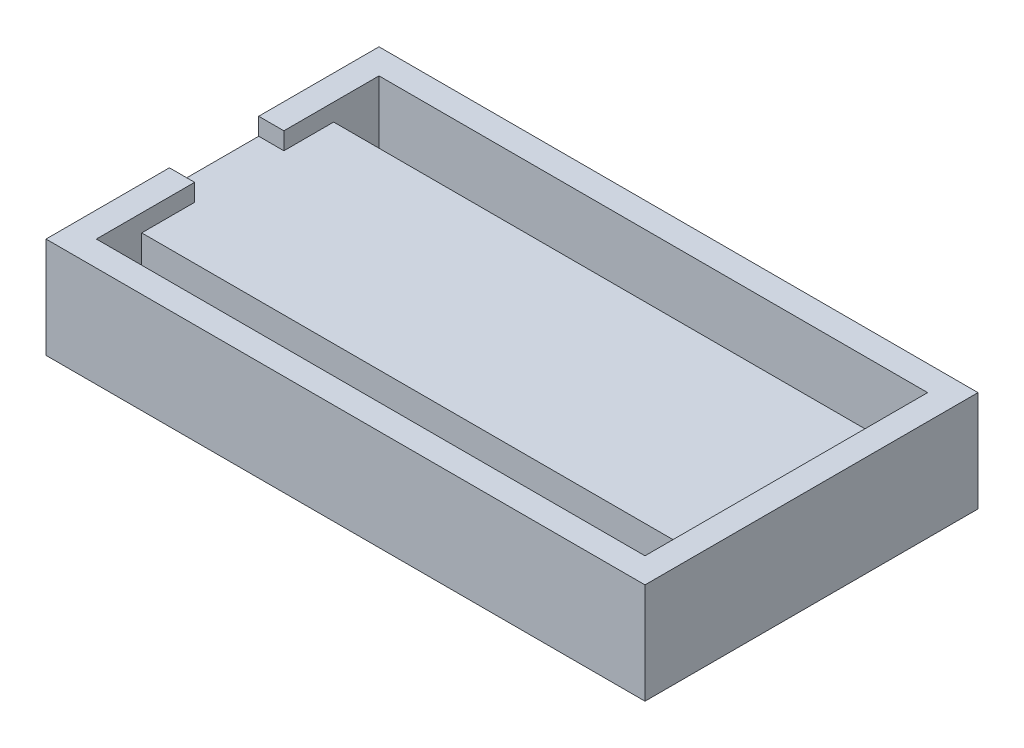
ISO-10303-21;
HEADER;
FILE_DESCRIPTION(('STEP AP214'),'2;1');
FILE_NAME('part.step','',(''),(''),'','','');
FILE_SCHEMA(('AUTOMOTIVE_DESIGN { 1 0 10303 214 1 1 1 1 }'));
ENDSEC;
DATA;
#1=APPLICATION_CONTEXT('core data for automotive mechanical design processes');
#2=APPLICATION_PROTOCOL_DEFINITION('international standard','automotive_design',2000,#1);
#3=PRODUCT_CONTEXT('',#1,'mechanical');
#4=PRODUCT('Part','Part','',(#3));
#5=PRODUCT_RELATED_PRODUCT_CATEGORY('part','',(#4));
#6=PRODUCT_DEFINITION_FORMATION('','',#4);
#7=PRODUCT_DEFINITION_CONTEXT('part definition',#1,'design');
#8=PRODUCT_DEFINITION('design','',#6,#7);
#9=PRODUCT_DEFINITION_SHAPE('','',#8);
#10=(LENGTH_UNIT() NAMED_UNIT(*) SI_UNIT(.MILLI.,.METRE.));
#11=(NAMED_UNIT(*) PLANE_ANGLE_UNIT() SI_UNIT($,.RADIAN.));
#12=(NAMED_UNIT(*) SI_UNIT($,.STERADIAN.) SOLID_ANGLE_UNIT());
#13=UNCERTAINTY_MEASURE_WITH_UNIT(LENGTH_MEASURE(1.E-05),#10,'distance_accuracy_value','');
#14=(GEOMETRIC_REPRESENTATION_CONTEXT(3) GLOBAL_UNCERTAINTY_ASSIGNED_CONTEXT((#13)) GLOBAL_UNIT_ASSIGNED_CONTEXT((#10,
#11,#12)) REPRESENTATION_CONTEXT('',''));
#15=CARTESIAN_POINT('',(0.,0.,0.));
#16=DIRECTION('',(0.,0.,1.));
#17=DIRECTION('',(1.,0.,0.));
#18=AXIS2_PLACEMENT_3D('',#15,#16,#17);
#19=CARTESIAN_POINT('',(29.725,10.,-16.525));
#20=DIRECTION('',(-1.,0.,0.));
#21=DIRECTION('',(0.,0.,1.));
#22=AXIS2_PLACEMENT_3D('',#19,#20,#21);
#23=PLANE('',#22);
#24=DIRECTION('',(0.,0.,-1.));
#25=VECTOR('',#24,1.);
#26=CARTESIAN_POINT('',(29.725,0.,-16.525));
#27=LINE('',#26,#25);
#28=CARTESIAN_POINT('',(29.725,0.,16.525));
#29=VERTEX_POINT('',#28);
#30=CARTESIAN_POINT('',(29.725,0.,-16.525));
#31=VERTEX_POINT('',#30);
#32=EDGE_CURVE('E198',#29,#31,#27,.T.);
#33=ORIENTED_EDGE('',*,*,#32,.T.);
#34=DIRECTION('',(0.,-1.,0.));
#35=VECTOR('',#34,1.);
#36=CARTESIAN_POINT('',(29.725,10.,-16.525));
#37=LINE('',#36,#35);
#38=CARTESIAN_POINT('',(29.725,10.,-16.525));
#39=VERTEX_POINT('',#38);
#40=EDGE_CURVE('E237',#39,#31,#37,.T.);
#41=ORIENTED_EDGE('',*,*,#40,.F.);
#42=DIRECTION('',(0.,0.,-1.));
#43=VECTOR('',#42,1.);
#44=CARTESIAN_POINT('',(29.725,10.,-16.525));
#45=LINE('',#44,#43);
#46=CARTESIAN_POINT('',(29.725,10.,16.525));
#47=VERTEX_POINT('',#46);
#48=EDGE_CURVE('E218',#47,#39,#45,.T.);
#49=ORIENTED_EDGE('',*,*,#48,.F.);
#50=DIRECTION('',(0.,-1.,0.));
#51=VECTOR('',#50,1.);
#52=CARTESIAN_POINT('',(29.725,10.,16.525));
#53=LINE('',#52,#51);
#54=EDGE_CURVE('E233',#47,#29,#53,.T.);
#55=ORIENTED_EDGE('',*,*,#54,.T.);
#56=EDGE_LOOP('',(#33,#41,#49,#55));
#57=FACE_BOUND('',#56,.T.);
#58=ADVANCED_FACE('F39',(#57),#23,.F.);
#59=CARTESIAN_POINT('',(-29.725,10.,-16.525));
#60=DIRECTION('',(0.,0.,1.));
#61=DIRECTION('',(1.,0.,0.));
#62=AXIS2_PLACEMENT_3D('',#59,#60,#61);
#63=PLANE('',#62);
#64=DIRECTION('',(-1.,0.,0.));
#65=VECTOR('',#64,1.);
#66=CARTESIAN_POINT('',(-29.725,0.,-16.525));
#67=LINE('',#66,#65);
#68=CARTESIAN_POINT('',(-29.725,0.,-16.525));
#69=VERTEX_POINT('',#68);
#70=EDGE_CURVE('E226',#31,#69,#67,.T.);
#71=ORIENTED_EDGE('',*,*,#70,.T.);
#72=DIRECTION('',(0.,-1.,0.));
#73=VECTOR('',#72,1.);
#74=CARTESIAN_POINT('',(-29.725,10.,-16.525));
#75=LINE('',#74,#73);
#76=CARTESIAN_POINT('',(-29.725,10.,-16.525));
#77=VERTEX_POINT('',#76);
#78=EDGE_CURVE('E238',#77,#69,#75,.T.);
#79=ORIENTED_EDGE('',*,*,#78,.F.);
#80=DIRECTION('',(-1.,0.,0.));
#81=VECTOR('',#80,1.);
#82=CARTESIAN_POINT('',(-29.725,10.,-16.525));
#83=LINE('',#82,#81);
#84=EDGE_CURVE('E225',#39,#77,#83,.T.);
#85=ORIENTED_EDGE('',*,*,#84,.F.);
#86=ORIENTED_EDGE('',*,*,#40,.T.);
#87=EDGE_LOOP('',(#71,#79,#85,#86));
#88=FACE_BOUND('',#87,.T.);
#89=ADVANCED_FACE('F324',(#88),#63,.F.);
#90=CARTESIAN_POINT('',(-29.725,10.,-16.525));
#91=DIRECTION('',(1.,0.,0.));
#92=DIRECTION('',(0.,0.,-1.));
#93=AXIS2_PLACEMENT_3D('',#90,#91,#92);
#94=PLANE('',#93);
#95=DIRECTION('',(0.,0.,1.));
#96=VECTOR('',#95,1.);
#97=CARTESIAN_POINT('',(-29.725,8.28,-16.525));
#98=LINE('',#97,#96);
#99=CARTESIAN_POINT('',(-29.725,8.28,-4.58499999095666));
#100=VERTEX_POINT('',#99);
#101=CARTESIAN_POINT('',(-29.725,8.28,4.275));
#102=VERTEX_POINT('',#101);
#103=EDGE_CURVE('E216',#100,#102,#98,.T.);
#104=ORIENTED_EDGE('',*,*,#103,.F.);
#105=DIRECTION('',(0.,1.,0.));
#106=VECTOR('',#105,1.);
#107=CARTESIAN_POINT('',(-29.725,8.28,-4.58499999095666));
#108=LINE('',#107,#106);
#109=CARTESIAN_POINT('',(-29.725,10.,-4.58499999095666));
#110=VERTEX_POINT('',#109);
#111=EDGE_CURVE('E204',#100,#110,#108,.T.);
#112=ORIENTED_EDGE('',*,*,#111,.T.);
#113=DIRECTION('',(0.,0.,1.));
#114=VECTOR('',#113,1.);
#115=CARTESIAN_POINT('',(-29.725,10.,0.));
#116=LINE('',#115,#114);
#117=EDGE_CURVE('E246',#77,#110,#116,.T.);
#118=ORIENTED_EDGE('',*,*,#117,.F.);
#119=ORIENTED_EDGE('',*,*,#78,.T.);
#120=DIRECTION('',(0.,0.,1.));
#121=VECTOR('',#120,1.);
#122=CARTESIAN_POINT('',(-29.725,0.,-16.525));
#123=LINE('',#122,#121);
#124=CARTESIAN_POINT('',(-29.725,0.,16.525));
#125=VERTEX_POINT('',#124);
#126=EDGE_CURVE('E227',#69,#125,#123,.T.);
#127=ORIENTED_EDGE('',*,*,#126,.T.);
#128=DIRECTION('',(0.,-1.,0.));
#129=VECTOR('',#128,1.);
#130=CARTESIAN_POINT('',(-29.725,10.,16.525));
#131=LINE('',#130,#129);
#132=CARTESIAN_POINT('',(-29.725,10.,16.525));
#133=VERTEX_POINT('',#132);
#134=EDGE_CURVE('E234',#133,#125,#131,.T.);
#135=ORIENTED_EDGE('',*,*,#134,.F.);
#136=DIRECTION('',(0.,0.,1.));
#137=VECTOR('',#136,1.);
#138=CARTESIAN_POINT('',(-29.725,10.,0.));
#139=LINE('',#138,#137);
#140=CARTESIAN_POINT('',(-29.725,10.,4.275));
#141=VERTEX_POINT('',#140);
#142=EDGE_CURVE('E245',#141,#133,#139,.T.);
#143=ORIENTED_EDGE('',*,*,#142,.F.);
#144=DIRECTION('',(0.,1.,0.));
#145=VECTOR('',#144,1.);
#146=CARTESIAN_POINT('',(-29.725,8.28,4.275));
#147=LINE('',#146,#145);
#148=EDGE_CURVE('E203',#102,#141,#147,.T.);
#149=ORIENTED_EDGE('',*,*,#148,.F.);
#150=EDGE_LOOP('',(#104,#112,#118,#119,#127,#135,#143,#149));
#151=FACE_BOUND('',#150,.T.);
#152=ADVANCED_FACE('F313',(#151),#94,.F.);
#153=CARTESIAN_POINT('',(-29.725,10.,16.525));
#154=DIRECTION('',(0.,0.,-1.));
#155=DIRECTION('',(-1.,0.,0.));
#156=AXIS2_PLACEMENT_3D('',#153,#154,#155);
#157=PLANE('',#156);
#158=DIRECTION('',(1.,0.,0.));
#159=VECTOR('',#158,1.);
#160=CARTESIAN_POINT('',(-29.725,0.,16.525));
#161=LINE('',#160,#159);
#162=EDGE_CURVE('E224',#125,#29,#161,.T.);
#163=ORIENTED_EDGE('',*,*,#162,.T.);
#164=ORIENTED_EDGE('',*,*,#54,.F.);
#165=DIRECTION('',(1.,0.,0.));
#166=VECTOR('',#165,1.);
#167=CARTESIAN_POINT('',(-29.725,10.,16.525));
#168=LINE('',#167,#166);
#169=EDGE_CURVE('E232',#133,#47,#168,.T.);
#170=ORIENTED_EDGE('',*,*,#169,.F.);
#171=ORIENTED_EDGE('',*,*,#134,.T.);
#172=EDGE_LOOP('',(#163,#164,#170,#171));
#173=FACE_BOUND('',#172,.T.);
#174=ADVANCED_FACE('F319',(#173),#157,.F.);
#175=CARTESIAN_POINT('',(0.,10.,0.));
#176=DIRECTION('',(0.,1.,0.));
#177=DIRECTION('',(0.,0.,1.));
#178=AXIS2_PLACEMENT_3D('',#175,#176,#177);
#179=PLANE('',#178);
#180=DIRECTION('',(-1.,0.,0.));
#181=VECTOR('',#180,1.);
#182=CARTESIAN_POINT('',(-29.725,10.,-4.58499999095666));
#183=LINE('',#182,#181);
#184=CARTESIAN_POINT('',(-27.225,10.,-4.58499999095666));
#185=VERTEX_POINT('',#184);
#186=EDGE_CURVE('E189',#185,#110,#183,.T.);
#187=ORIENTED_EDGE('',*,*,#186,.F.);
#188=DIRECTION('',(0.,0.,1.));
#189=VECTOR('',#188,1.);
#190=CARTESIAN_POINT('',(-27.225,10.,-14.025));
#191=LINE('',#190,#189);
#192=CARTESIAN_POINT('',(-27.225,10.,-14.025));
#193=VERTEX_POINT('',#192);
#194=EDGE_CURVE('E190',#193,#185,#191,.T.);
#195=ORIENTED_EDGE('',*,*,#194,.F.);
#196=DIRECTION('',(-1.,0.,0.));
#197=VECTOR('',#196,1.);
#198=CARTESIAN_POINT('',(-27.225,10.,-14.025));
#199=LINE('',#198,#197);
#200=CARTESIAN_POINT('',(27.225,10.,-14.025));
#201=VERTEX_POINT('',#200);
#202=EDGE_CURVE('E184',#201,#193,#199,.T.);
#203=ORIENTED_EDGE('',*,*,#202,.F.);
#204=DIRECTION('',(0.,0.,-1.));
#205=VECTOR('',#204,1.);
#206=CARTESIAN_POINT('',(27.225,10.,-14.025));
#207=LINE('',#206,#205);
#208=CARTESIAN_POINT('',(27.225,10.,14.025));
#209=VERTEX_POINT('',#208);
#210=EDGE_CURVE('E158',#209,#201,#207,.T.);
#211=ORIENTED_EDGE('',*,*,#210,.F.);
#212=DIRECTION('',(1.,0.,0.));
#213=VECTOR('',#212,1.);
#214=CARTESIAN_POINT('',(-27.225,10.,14.025));
#215=LINE('',#214,#213);
#216=CARTESIAN_POINT('',(-27.225,10.,14.025));
#217=VERTEX_POINT('',#216);
#218=EDGE_CURVE('E166',#217,#209,#215,.T.);
#219=ORIENTED_EDGE('',*,*,#218,.F.);
#220=DIRECTION('',(0.,0.,1.));
#221=VECTOR('',#220,1.);
#222=CARTESIAN_POINT('',(-27.225,10.,4.275));
#223=LINE('',#222,#221);
#224=CARTESIAN_POINT('',(-27.225,10.,4.275));
#225=VERTEX_POINT('',#224);
#226=EDGE_CURVE('E173',#225,#217,#223,.T.);
#227=ORIENTED_EDGE('',*,*,#226,.F.);
#228=DIRECTION('',(1.,0.,0.));
#229=VECTOR('',#228,1.);
#230=CARTESIAN_POINT('',(-27.225,10.,4.275));
#231=LINE('',#230,#229);
#232=EDGE_CURVE('E195',#141,#225,#231,.T.);
#233=ORIENTED_EDGE('',*,*,#232,.F.);
#234=ORIENTED_EDGE('',*,*,#142,.T.);
#235=ORIENTED_EDGE('',*,*,#169,.T.);
#236=ORIENTED_EDGE('',*,*,#48,.T.);
#237=ORIENTED_EDGE('',*,*,#84,.T.);
#238=ORIENTED_EDGE('',*,*,#117,.T.);
#239=EDGE_LOOP('',(#187,#195,#203,#211,#219,#227,#233,#234,#235,#236,#237,#238));
#240=FACE_BOUND('',#239,.T.);
#241=ADVANCED_FACE('F300',(#240),#179,.T.);
#242=CARTESIAN_POINT('',(0.,0.,0.));
#243=DIRECTION('',(0.,1.,0.));
#244=DIRECTION('',(0.,0.,1.));
#245=AXIS2_PLACEMENT_3D('',#242,#243,#244);
#246=PLANE('',#245);
#247=DIRECTION('',(1.,0.,0.));
#248=VECTOR('',#247,1.);
#249=CARTESIAN_POINT('',(0.,0.,-9.52500000000001));
#250=LINE('',#249,#248);
#251=CARTESIAN_POINT('',(-27.225,0.,-9.52500000000001));
#252=VERTEX_POINT('',#251);
#253=CARTESIAN_POINT('',(27.225,0.,-9.52500000000002));
#254=VERTEX_POINT('',#253);
#255=EDGE_CURVE('E46',#252,#254,#250,.T.);
#256=ORIENTED_EDGE('',*,*,#255,.T.);
#257=DIRECTION('',(0.,0.,-1.));
#258=VECTOR('',#257,1.);
#259=CARTESIAN_POINT('',(27.225,0.,0.));
#260=LINE('',#259,#258);
#261=CARTESIAN_POINT('',(27.225,0.,-14.025));
#262=VERTEX_POINT('',#261);
#263=EDGE_CURVE('E11',#254,#262,#260,.T.);
#264=ORIENTED_EDGE('',*,*,#263,.T.);
#265=DIRECTION('',(-1.,0.,0.));
#266=VECTOR('',#265,1.);
#267=CARTESIAN_POINT('',(0.,0.,-14.025));
#268=LINE('',#267,#266);
#269=CARTESIAN_POINT('',(-27.225,0.,-14.025));
#270=VERTEX_POINT('',#269);
#271=EDGE_CURVE('E266',#262,#270,#268,.T.);
#272=ORIENTED_EDGE('',*,*,#271,.T.);
#273=DIRECTION('',(0.,0.,1.));
#274=VECTOR('',#273,1.);
#275=CARTESIAN_POINT('',(-27.225,0.,0.));
#276=LINE('',#275,#274);
#277=EDGE_CURVE('E267',#270,#252,#276,.T.);
#278=ORIENTED_EDGE('',*,*,#277,.T.);
#279=EDGE_LOOP('',(#256,#264,#272,#278));
#280=FACE_BOUND('',#279,.T.);
#281=DIRECTION('',(1.,0.,0.));
#282=VECTOR('',#281,1.);
#283=CARTESIAN_POINT('',(0.,0.,14.025));
#284=LINE('',#283,#282);
#285=CARTESIAN_POINT('',(-27.225,0.,14.025));
#286=VERTEX_POINT('',#285);
#287=CARTESIAN_POINT('',(27.225,0.,14.025));
#288=VERTEX_POINT('',#287);
#289=EDGE_CURVE('E257',#286,#288,#284,.T.);
#290=ORIENTED_EDGE('',*,*,#289,.T.);
#291=DIRECTION('',(0.,0.,-1.));
#292=VECTOR('',#291,1.);
#293=CARTESIAN_POINT('',(27.225,0.,0.));
#294=LINE('',#293,#292);
#295=CARTESIAN_POINT('',(27.225,0.,9.52500000000002));
#296=VERTEX_POINT('',#295);
#297=EDGE_CURVE('E263',#288,#296,#294,.T.);
#298=ORIENTED_EDGE('',*,*,#297,.T.);
#299=DIRECTION('',(-1.,0.,0.));
#300=VECTOR('',#299,1.);
#301=CARTESIAN_POINT('',(0.,0.,9.52500000000001));
#302=LINE('',#301,#300);
#303=CARTESIAN_POINT('',(-27.225,0.,9.52500000000001));
#304=VERTEX_POINT('',#303);
#305=EDGE_CURVE('E239',#296,#304,#302,.T.);
#306=ORIENTED_EDGE('',*,*,#305,.T.);
#307=DIRECTION('',(0.,0.,1.));
#308=VECTOR('',#307,1.);
#309=CARTESIAN_POINT('',(-27.225,0.,0.));
#310=LINE('',#309,#308);
#311=EDGE_CURVE('E260',#304,#286,#310,.T.);
#312=ORIENTED_EDGE('',*,*,#311,.T.);
#313=EDGE_LOOP('',(#290,#298,#306,#312));
#314=FACE_BOUND('',#313,.T.);
#315=ORIENTED_EDGE('',*,*,#32,.F.);
#316=ORIENTED_EDGE('',*,*,#162,.F.);
#317=ORIENTED_EDGE('',*,*,#126,.F.);
#318=ORIENTED_EDGE('',*,*,#70,.F.);
#319=EDGE_LOOP('',(#315,#316,#317,#318));
#320=FACE_BOUND('',#319,.T.);
#321=ADVANCED_FACE('F275',(#280,#314,#320),#246,.F.);
#322=CARTESIAN_POINT('',(27.225,8.28,-14.025));
#323=DIRECTION('',(1.,0.,0.));
#324=DIRECTION('',(0.,0.,-1.));
#325=AXIS2_PLACEMENT_3D('',#322,#323,#324);
#326=PLANE('',#325);
#327=ORIENTED_EDGE('',*,*,#210,.T.);
#328=DIRECTION('',(0.,1.,0.));
#329=VECTOR('',#328,1.);
#330=CARTESIAN_POINT('',(27.225,8.28,-14.025));
#331=LINE('',#330,#329);
#332=EDGE_CURVE('E182',#262,#201,#331,.T.);
#333=ORIENTED_EDGE('',*,*,#332,.F.);
#334=ORIENTED_EDGE('',*,*,#263,.F.);
#335=DIRECTION('',(0.,1.,0.));
#336=VECTOR('',#335,1.);
#337=CARTESIAN_POINT('',(27.225,-0.919999999999999,-9.52500000000002));
#338=LINE('',#337,#336);
#339=CARTESIAN_POINT('',(27.225,8.28,-9.52500000000002));
#340=VERTEX_POINT('',#339);
#341=EDGE_CURVE('E153',#254,#340,#338,.T.);
#342=ORIENTED_EDGE('',*,*,#341,.T.);
#343=DIRECTION('',(0.,0.,-1.));
#344=VECTOR('',#343,1.);
#345=CARTESIAN_POINT('',(27.225,8.28,-14.025));
#346=LINE('',#345,#344);
#347=CARTESIAN_POINT('',(27.225,8.28,9.52500000000001));
#348=VERTEX_POINT('',#347);
#349=EDGE_CURVE('E156',#348,#340,#346,.T.);
#350=ORIENTED_EDGE('',*,*,#349,.F.);
#351=DIRECTION('',(0.,1.,0.));
#352=VECTOR('',#351,1.);
#353=CARTESIAN_POINT('',(27.225,-0.919999999999999,9.52500000000002));
#354=LINE('',#353,#352);
#355=EDGE_CURVE('E52',#296,#348,#354,.T.);
#356=ORIENTED_EDGE('',*,*,#355,.F.);
#357=ORIENTED_EDGE('',*,*,#297,.F.);
#358=DIRECTION('',(0.,1.,0.));
#359=VECTOR('',#358,1.);
#360=CARTESIAN_POINT('',(27.225,8.28,14.025));
#361=LINE('',#360,#359);
#362=EDGE_CURVE('E194',#288,#209,#361,.T.);
#363=ORIENTED_EDGE('',*,*,#362,.T.);
#364=EDGE_LOOP('',(#327,#333,#334,#342,#350,#356,#357,#363));
#365=FACE_BOUND('',#364,.T.);
#366=ADVANCED_FACE('F152',(#365),#326,.F.);
#367=CARTESIAN_POINT('',(-27.225,8.28,14.025));
#368=DIRECTION('',(0.,0.,1.));
#369=DIRECTION('',(1.,0.,0.));
#370=AXIS2_PLACEMENT_3D('',#367,#368,#369);
#371=PLANE('',#370);
#372=ORIENTED_EDGE('',*,*,#218,.T.);
#373=ORIENTED_EDGE('',*,*,#362,.F.);
#374=ORIENTED_EDGE('',*,*,#289,.F.);
#375=DIRECTION('',(0.,1.,0.));
#376=VECTOR('',#375,1.);
#377=CARTESIAN_POINT('',(-27.225,8.28,14.025));
#378=LINE('',#377,#376);
#379=EDGE_CURVE('E197',#286,#217,#378,.T.);
#380=ORIENTED_EDGE('',*,*,#379,.T.);
#381=EDGE_LOOP('',(#372,#373,#374,#380));
#382=FACE_BOUND('',#381,.T.);
#383=ADVANCED_FACE('F299',(#382),#371,.F.);
#384=CARTESIAN_POINT('',(-27.225,8.28,4.275));
#385=DIRECTION('',(-1.,0.,0.));
#386=DIRECTION('',(0.,0.,1.));
#387=AXIS2_PLACEMENT_3D('',#384,#385,#386);
#388=PLANE('',#387);
#389=ORIENTED_EDGE('',*,*,#226,.T.);
#390=ORIENTED_EDGE('',*,*,#379,.F.);
#391=ORIENTED_EDGE('',*,*,#311,.F.);
#392=DIRECTION('',(0.,1.,0.));
#393=VECTOR('',#392,1.);
#394=CARTESIAN_POINT('',(-27.225,-0.919999999999999,9.52500000000001));
#395=LINE('',#394,#393);
#396=CARTESIAN_POINT('',(-27.225,8.28,9.52500000000001));
#397=VERTEX_POINT('',#396);
#398=EDGE_CURVE('E278',#304,#397,#395,.T.);
#399=ORIENTED_EDGE('',*,*,#398,.T.);
#400=DIRECTION('',(0.,0.,1.));
#401=VECTOR('',#400,1.);
#402=CARTESIAN_POINT('',(-27.225,8.28,4.275));
#403=LINE('',#402,#401);
#404=CARTESIAN_POINT('',(-27.225,8.28,4.275));
#405=VERTEX_POINT('',#404);
#406=EDGE_CURVE('E179',#405,#397,#403,.T.);
#407=ORIENTED_EDGE('',*,*,#406,.F.);
#408=DIRECTION('',(0.,1.,0.));
#409=VECTOR('',#408,1.);
#410=CARTESIAN_POINT('',(-27.225,8.28,4.275));
#411=LINE('',#410,#409);
#412=EDGE_CURVE('E200',#405,#225,#411,.T.);
#413=ORIENTED_EDGE('',*,*,#412,.T.);
#414=EDGE_LOOP('',(#389,#390,#391,#399,#407,#413));
#415=FACE_BOUND('',#414,.T.);
#416=ADVANCED_FACE('F283',(#415),#388,.F.);
#417=CARTESIAN_POINT('',(-27.225,8.28,4.275));
#418=DIRECTION('',(0.,0.,1.));
#419=DIRECTION('',(1.,0.,0.));
#420=AXIS2_PLACEMENT_3D('',#417,#418,#419);
#421=PLANE('',#420);
#422=ORIENTED_EDGE('',*,*,#232,.T.);
#423=ORIENTED_EDGE('',*,*,#412,.F.);
#424=DIRECTION('',(1.,0.,0.));
#425=VECTOR('',#424,1.);
#426=CARTESIAN_POINT('',(-27.225,8.28,4.275));
#427=LINE('',#426,#425);
#428=EDGE_CURVE('E185',#102,#405,#427,.T.);
#429=ORIENTED_EDGE('',*,*,#428,.F.);
#430=ORIENTED_EDGE('',*,*,#148,.T.);
#431=EDGE_LOOP('',(#422,#423,#429,#430));
#432=FACE_BOUND('',#431,.T.);
#433=ADVANCED_FACE('F289',(#432),#421,.F.);
#434=CARTESIAN_POINT('',(-29.725,8.28,-4.58499999095666));
#435=DIRECTION('',(0.,0.,-1.));
#436=DIRECTION('',(-1.,0.,0.));
#437=AXIS2_PLACEMENT_3D('',#434,#435,#436);
#438=PLANE('',#437);
#439=ORIENTED_EDGE('',*,*,#186,.T.);
#440=ORIENTED_EDGE('',*,*,#111,.F.);
#441=DIRECTION('',(-1.,0.,0.));
#442=VECTOR('',#441,1.);
#443=CARTESIAN_POINT('',(-29.725,8.28,-4.58499999095666));
#444=LINE('',#443,#442);
#445=CARTESIAN_POINT('',(-27.225,8.28,-4.58499999095666));
#446=VERTEX_POINT('',#445);
#447=EDGE_CURVE('E171',#446,#100,#444,.T.);
#448=ORIENTED_EDGE('',*,*,#447,.F.);
#449=DIRECTION('',(0.,1.,0.));
#450=VECTOR('',#449,1.);
#451=CARTESIAN_POINT('',(-27.225,8.28,-4.58499999095666));
#452=LINE('',#451,#450);
#453=EDGE_CURVE('E205',#446,#185,#452,.T.);
#454=ORIENTED_EDGE('',*,*,#453,.T.);
#455=EDGE_LOOP('',(#439,#440,#448,#454));
#456=FACE_BOUND('',#455,.T.);
#457=ADVANCED_FACE('F310',(#456),#438,.F.);
#458=CARTESIAN_POINT('',(-27.225,8.28,-14.025));
#459=DIRECTION('',(-1.,0.,0.));
#460=DIRECTION('',(0.,0.,1.));
#461=AXIS2_PLACEMENT_3D('',#458,#459,#460);
#462=PLANE('',#461);
#463=ORIENTED_EDGE('',*,*,#194,.T.);
#464=ORIENTED_EDGE('',*,*,#453,.F.);
#465=DIRECTION('',(0.,0.,1.));
#466=VECTOR('',#465,1.);
#467=CARTESIAN_POINT('',(-27.225,8.28,-14.025));
#468=LINE('',#467,#466);
#469=CARTESIAN_POINT('',(-27.225,8.28,-9.52500000000001));
#470=VERTEX_POINT('',#469);
#471=EDGE_CURVE('E169',#470,#446,#468,.T.);
#472=ORIENTED_EDGE('',*,*,#471,.F.);
#473=DIRECTION('',(0.,1.,0.));
#474=VECTOR('',#473,1.);
#475=CARTESIAN_POINT('',(-27.225,-0.919999999999999,-9.52500000000001));
#476=LINE('',#475,#474);
#477=EDGE_CURVE('E61',#252,#470,#476,.T.);
#478=ORIENTED_EDGE('',*,*,#477,.F.);
#479=ORIENTED_EDGE('',*,*,#277,.F.);
#480=DIRECTION('',(0.,1.,0.));
#481=VECTOR('',#480,1.);
#482=CARTESIAN_POINT('',(-27.225,8.28,-14.025));
#483=LINE('',#482,#481);
#484=EDGE_CURVE('E202',#270,#193,#483,.T.);
#485=ORIENTED_EDGE('',*,*,#484,.T.);
#486=EDGE_LOOP('',(#463,#464,#472,#478,#479,#485));
#487=FACE_BOUND('',#486,.T.);
#488=ADVANCED_FACE('F277',(#487),#462,.F.);
#489=CARTESIAN_POINT('',(-27.225,8.28,-14.025));
#490=DIRECTION('',(0.,0.,-1.));
#491=DIRECTION('',(-1.,0.,0.));
#492=AXIS2_PLACEMENT_3D('',#489,#490,#491);
#493=PLANE('',#492);
#494=ORIENTED_EDGE('',*,*,#202,.T.);
#495=ORIENTED_EDGE('',*,*,#484,.F.);
#496=ORIENTED_EDGE('',*,*,#271,.F.);
#497=ORIENTED_EDGE('',*,*,#332,.T.);
#498=EDGE_LOOP('',(#494,#495,#496,#497));
#499=FACE_BOUND('',#498,.T.);
#500=ADVANCED_FACE('F302',(#499),#493,.F.);
#501=CARTESIAN_POINT('',(0.,8.28,0.));
#502=DIRECTION('',(0.,1.,0.));
#503=DIRECTION('',(0.,0.,1.));
#504=AXIS2_PLACEMENT_3D('',#501,#502,#503);
#505=PLANE('',#504);
#506=DIRECTION('',(1.,0.,0.));
#507=VECTOR('',#506,1.);
#508=CARTESIAN_POINT('',(-27.225,8.28,-9.52500000000001));
#509=LINE('',#508,#507);
#510=EDGE_CURVE('E159',#470,#340,#509,.T.);
#511=ORIENTED_EDGE('',*,*,#510,.F.);
#512=ORIENTED_EDGE('',*,*,#471,.T.);
#513=ORIENTED_EDGE('',*,*,#447,.T.);
#514=ORIENTED_EDGE('',*,*,#103,.T.);
#515=ORIENTED_EDGE('',*,*,#428,.T.);
#516=ORIENTED_EDGE('',*,*,#406,.T.);
#517=DIRECTION('',(-1.,0.,0.));
#518=VECTOR('',#517,1.);
#519=CARTESIAN_POINT('',(-27.225,8.28,9.52500000000001));
#520=LINE('',#519,#518);
#521=EDGE_CURVE('E163',#348,#397,#520,.T.);
#522=ORIENTED_EDGE('',*,*,#521,.F.);
#523=ORIENTED_EDGE('',*,*,#349,.T.);
#524=EDGE_LOOP('',(#511,#512,#513,#514,#515,#516,#522,#523));
#525=FACE_BOUND('',#524,.T.);
#526=ADVANCED_FACE('F167',(#525),#505,.T.);
#527=CARTESIAN_POINT('',(-27.225,-0.919999999999999,9.52500000000001));
#528=DIRECTION('',(0.,0.,-1.));
#529=DIRECTION('',(-1.,0.,0.));
#530=AXIS2_PLACEMENT_3D('',#527,#528,#529);
#531=PLANE('',#530);
#532=ORIENTED_EDGE('',*,*,#355,.T.);
#533=ORIENTED_EDGE('',*,*,#521,.T.);
#534=ORIENTED_EDGE('',*,*,#398,.F.);
#535=ORIENTED_EDGE('',*,*,#305,.F.);
#536=EDGE_LOOP('',(#532,#533,#534,#535));
#537=FACE_BOUND('',#536,.T.);
#538=ADVANCED_FACE('F284',(#537),#531,.F.);
#539=CARTESIAN_POINT('',(-27.225,-0.919999999999999,-9.52500000000001));
#540=DIRECTION('',(0.,0.,1.));
#541=DIRECTION('',(1.,0.,0.));
#542=AXIS2_PLACEMENT_3D('',#539,#540,#541);
#543=PLANE('',#542);
#544=ORIENTED_EDGE('',*,*,#477,.T.);
#545=ORIENTED_EDGE('',*,*,#510,.T.);
#546=ORIENTED_EDGE('',*,*,#341,.F.);
#547=ORIENTED_EDGE('',*,*,#255,.F.);
#548=EDGE_LOOP('',(#544,#545,#546,#547));
#549=FACE_BOUND('',#548,.T.);
#550=ADVANCED_FACE('F161',(#549),#543,.F.);
#551=CLOSED_SHELL('',(#58,#89,#152,#174,#241,#321,#366,#383,#416,#433,#457,#488,#500,#526,#538,#550));
#552=MANIFOLD_SOLID_BREP('B2',#551);
#553=ADVANCED_BREP_SHAPE_REPRESENTATION('',(#18,#552),#14);
#554=SHAPE_DEFINITION_REPRESENTATION(#9,#553);
ENDSEC;
END-ISO-10303-21;
